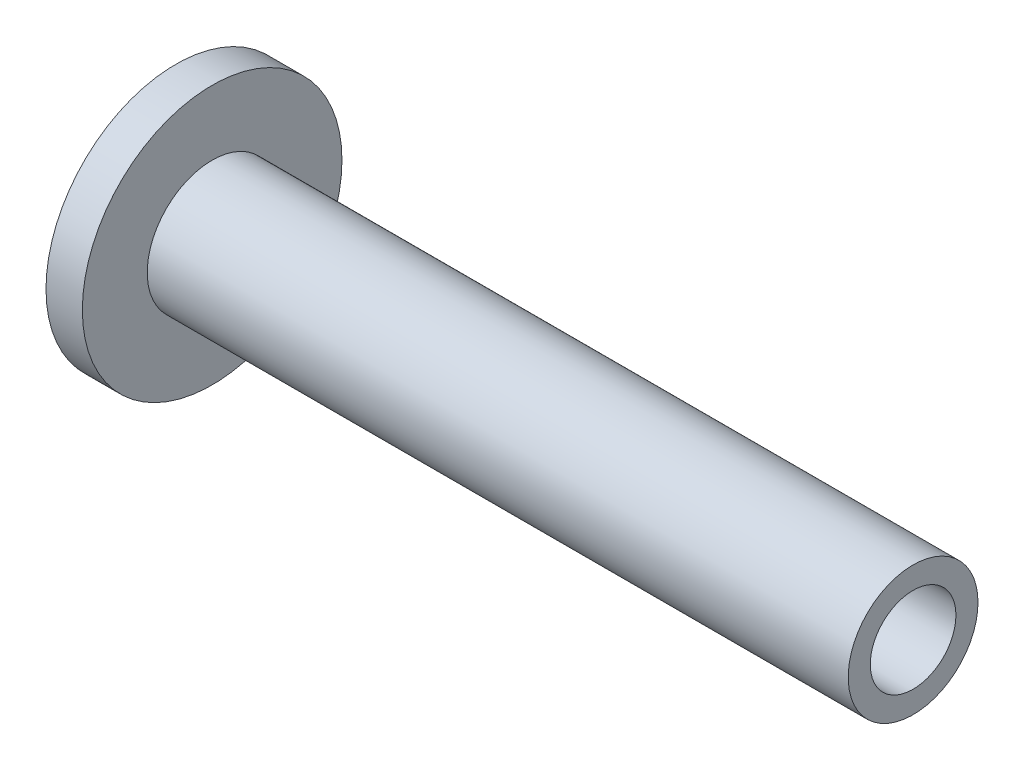
ISO-10303-21;
HEADER;
FILE_DESCRIPTION(('STEP AP214'),'2;1');
FILE_NAME('part.step','',(''),(''),'','','');
FILE_SCHEMA(('AUTOMOTIVE_DESIGN { 1 0 10303 214 1 1 1 1 }'));
ENDSEC;
DATA;
#1=APPLICATION_CONTEXT('core data for automotive mechanical design processes');
#2=APPLICATION_PROTOCOL_DEFINITION('international standard','automotive_design',2000,#1);
#3=PRODUCT_CONTEXT('',#1,'mechanical');
#4=PRODUCT('Part','Part','',(#3));
#5=PRODUCT_RELATED_PRODUCT_CATEGORY('part','',(#4));
#6=PRODUCT_DEFINITION_FORMATION('','',#4);
#7=PRODUCT_DEFINITION_CONTEXT('part definition',#1,'design');
#8=PRODUCT_DEFINITION('design','',#6,#7);
#9=PRODUCT_DEFINITION_SHAPE('','',#8);
#10=(LENGTH_UNIT() NAMED_UNIT(*) SI_UNIT(.MILLI.,.METRE.));
#11=(NAMED_UNIT(*) PLANE_ANGLE_UNIT() SI_UNIT($,.RADIAN.));
#12=(NAMED_UNIT(*) SI_UNIT($,.STERADIAN.) SOLID_ANGLE_UNIT());
#13=UNCERTAINTY_MEASURE_WITH_UNIT(LENGTH_MEASURE(1.E-05),#10,'distance_accuracy_value','');
#14=(GEOMETRIC_REPRESENTATION_CONTEXT(3) GLOBAL_UNCERTAINTY_ASSIGNED_CONTEXT((#13)) GLOBAL_UNIT_ASSIGNED_CONTEXT((#10,
#11,#12)) REPRESENTATION_CONTEXT('',''));
#15=CARTESIAN_POINT('',(0.,0.,0.));
#16=DIRECTION('',(0.,0.,1.));
#17=DIRECTION('',(1.,0.,0.));
#18=AXIS2_PLACEMENT_3D('',#15,#16,#17);
#19=CARTESIAN_POINT('',(1.9,0.,0.));
#20=DIRECTION('',(-1.,0.,0.));
#21=DIRECTION('',(0.,0.,1.));
#22=AXIS2_PLACEMENT_3D('',#19,#20,#21);
#23=CYLINDRICAL_SURFACE('',#22,5.);
#24=CARTESIAN_POINT('',(0.499999999999999,0.,0.));
#25=DIRECTION('',(1.,0.,0.));
#26=DIRECTION('',(0.,0.,-1.));
#27=AXIS2_PLACEMENT_3D('',#24,#25,#26);
#28=CIRCLE('',#27,5.);
#29=CARTESIAN_POINT('',(0.499999999999999,0.,5.));
#30=VERTEX_POINT('',#29);
#31=EDGE_CURVE('E45',#30,#30,#28,.T.);
#32=CARTESIAN_POINT('',(1.9,0.,0.));
#33=DIRECTION('',(1.,0.,0.));
#34=DIRECTION('',(0.,0.,-1.));
#35=AXIS2_PLACEMENT_3D('',#32,#33,#34);
#36=CIRCLE('',#35,5.);
#37=CARTESIAN_POINT('',(1.9,0.,5.));
#38=VERTEX_POINT('',#37);
#39=EDGE_CURVE('E68',#38,#38,#36,.T.);
#40=CARTESIAN_POINT('',(0.499999999999999,0.,5.));
#41=CARTESIAN_POINT('',(0.514583333333332,0.,5.));
#42=CARTESIAN_POINT('',(0.529166666666666,0.,5.));
#43=CARTESIAN_POINT('',(0.558333333333332,0.,5.));
#44=CARTESIAN_POINT('',(0.572916666666666,0.,5.));
#45=CARTESIAN_POINT('',(0.602083333333333,0.,5.));
#46=CARTESIAN_POINT('',(0.616666666666666,0.,5.));
#47=CARTESIAN_POINT('',(0.645833333333333,0.,5.));
#48=CARTESIAN_POINT('',(0.660416666666666,0.,5.));
#49=CARTESIAN_POINT('',(0.689583333333333,0.,5.));
#50=CARTESIAN_POINT('',(0.704166666666666,0.,5.));
#51=CARTESIAN_POINT('',(0.733333333333333,0.,5.));
#52=CARTESIAN_POINT('',(0.747916666666666,0.,5.));
#53=CARTESIAN_POINT('',(0.777083333333333,0.,5.));
#54=CARTESIAN_POINT('',(0.791666666666666,0.,5.));
#55=CARTESIAN_POINT('',(0.820833333333333,0.,5.));
#56=CARTESIAN_POINT('',(0.835416666666666,0.,5.));
#57=CARTESIAN_POINT('',(0.864583333333333,0.,5.));
#58=CARTESIAN_POINT('',(0.879166666666666,0.,5.));
#59=CARTESIAN_POINT('',(0.908333333333333,0.,5.));
#60=CARTESIAN_POINT('',(0.922916666666666,0.,5.));
#61=CARTESIAN_POINT('',(0.952083333333333,0.,5.));
#62=CARTESIAN_POINT('',(0.966666666666666,0.,5.));
#63=CARTESIAN_POINT('',(0.995833333333333,0.,5.));
#64=CARTESIAN_POINT('',(1.01041666666667,0.,5.));
#65=CARTESIAN_POINT('',(1.03958333333333,0.,5.));
#66=CARTESIAN_POINT('',(1.05416666666667,0.,5.));
#67=CARTESIAN_POINT('',(1.08333333333333,0.,5.));
#68=CARTESIAN_POINT('',(1.09791666666667,0.,5.));
#69=CARTESIAN_POINT('',(1.12708333333333,0.,5.));
#70=CARTESIAN_POINT('',(1.14166666666667,0.,5.));
#71=CARTESIAN_POINT('',(1.17083333333333,0.,5.));
#72=CARTESIAN_POINT('',(1.18541666666667,0.,5.));
#73=CARTESIAN_POINT('',(1.21458333333333,0.,5.));
#74=CARTESIAN_POINT('',(1.22916666666667,0.,5.));
#75=CARTESIAN_POINT('',(1.25833333333333,0.,5.));
#76=CARTESIAN_POINT('',(1.27291666666667,0.,5.));
#77=CARTESIAN_POINT('',(1.30208333333333,0.,5.));
#78=CARTESIAN_POINT('',(1.31666666666667,0.,5.));
#79=CARTESIAN_POINT('',(1.34583333333333,0.,5.));
#80=CARTESIAN_POINT('',(1.36041666666667,0.,5.));
#81=CARTESIAN_POINT('',(1.38958333333333,0.,5.));
#82=CARTESIAN_POINT('',(1.40416666666667,0.,5.));
#83=CARTESIAN_POINT('',(1.43333333333333,0.,5.));
#84=CARTESIAN_POINT('',(1.44791666666667,0.,5.));
#85=CARTESIAN_POINT('',(1.47708333333333,0.,5.));
#86=CARTESIAN_POINT('',(1.49166666666667,0.,5.));
#87=CARTESIAN_POINT('',(1.52083333333333,0.,5.));
#88=CARTESIAN_POINT('',(1.53541666666667,0.,5.));
#89=CARTESIAN_POINT('',(1.56458333333333,0.,5.));
#90=CARTESIAN_POINT('',(1.57916666666667,0.,5.));
#91=CARTESIAN_POINT('',(1.60833333333333,0.,5.));
#92=CARTESIAN_POINT('',(1.62291666666667,0.,5.));
#93=CARTESIAN_POINT('',(1.65208333333333,0.,5.));
#94=CARTESIAN_POINT('',(1.66666666666667,0.,5.));
#95=CARTESIAN_POINT('',(1.69583333333333,0.,5.));
#96=CARTESIAN_POINT('',(1.71041666666667,0.,5.));
#97=CARTESIAN_POINT('',(1.73958333333333,0.,5.));
#98=CARTESIAN_POINT('',(1.75416666666667,0.,5.));
#99=CARTESIAN_POINT('',(1.78333333333333,0.,5.));
#100=CARTESIAN_POINT('',(1.79791666666667,0.,5.));
#101=CARTESIAN_POINT('',(1.82708333333333,0.,5.));
#102=CARTESIAN_POINT('',(1.84166666666667,0.,5.));
#103=CARTESIAN_POINT('',(1.87083333333333,0.,5.));
#104=CARTESIAN_POINT('',(1.88541666666667,0.,5.));
#105=CARTESIAN_POINT('',(1.9,0.,5.));
#106=B_SPLINE_CURVE_WITH_KNOTS('',3,(#40,#41,#42,#43,#44,#45,#46,#47,#48,#49,#50,#51,#52,#53,
#54,#55,#56,#57,#58,#59,#60,#61,#62,#63,#64,#65,#66,#67,#68,#69,#70,#71,#72,#73,#74,#75,#76,#77,
#78,#79,#80,#81,#82,#83,#84,#85,#86,#87,#88,#89,#90,#91,#92,#93,#94,#95,#96,#97,#98,#99,#100,
#101,#102,#103,#104,#105),.UNSPECIFIED.,.F.,.F.,(4,2,2,2,2,2,2,2,2,2,2,2,2,2,2,2,2,2,2,2,2,2,2,
2,2,2,2,2,2,2,2,2,4),(0.,0.04375,0.0875000000000001,0.13125,0.175,0.21875,0.2625,0.30625,0.35,
0.39375,0.4375,0.48125,0.525,0.56875,0.6125,0.65625,0.7,0.74375,0.7875,0.83125,0.875,0.91875,
0.9625,1.00625,1.05,1.09375,1.1375,1.18125,1.225,1.26875,1.3125,1.35625,1.4),.UNSPECIFIED.);
#107=EDGE_CURVE('BSEAM38',#30,#38,#106,.T.);
#108=ORIENTED_EDGE('',*,*,#31,.T.);
#109=ORIENTED_EDGE('',*,*,#39,.F.);
#110=ORIENTED_EDGE('',*,*,#107,.T.);
#111=ORIENTED_EDGE('',*,*,#107,.F.);
#112=EDGE_LOOP('',(#108,#110,#109,#111));
#113=FACE_BOUND('',#112,.T.);
#114=ADVANCED_FACE('F38',(#113),#23,.T.);
#115=CARTESIAN_POINT('',(1.9,0.,0.));
#116=DIRECTION('',(1.,0.,0.));
#117=DIRECTION('',(0.,0.,-1.));
#118=AXIS2_PLACEMENT_3D('',#115,#116,#117);
#119=PLANE('',#118);
#120=CARTESIAN_POINT('',(1.9,0.,0.));
#121=DIRECTION('',(1.,0.,0.));
#122=DIRECTION('',(0.,0.,-1.));
#123=AXIS2_PLACEMENT_3D('',#120,#121,#122);
#124=CIRCLE('',#123,2.5);
#125=CARTESIAN_POINT('',(1.9,0.,-2.5));
#126=VERTEX_POINT('',#125);
#127=EDGE_CURVE('E58',#126,#126,#124,.T.);
#128=ORIENTED_EDGE('',*,*,#127,.F.);
#129=EDGE_LOOP('',(#128));
#130=FACE_BOUND('',#129,.T.);
#131=ORIENTED_EDGE('',*,*,#39,.T.);
#132=EDGE_LOOP('',(#131));
#133=FACE_BOUND('',#132,.T.);
#134=ADVANCED_FACE('F84',(#130,#133),#119,.T.);
#135=CARTESIAN_POINT('',(0.,0.,0.));
#136=DIRECTION('',(1.,0.,0.));
#137=DIRECTION('',(0.,0.,-1.));
#138=AXIS2_PLACEMENT_3D('',#135,#136,#137);
#139=PLANE('',#138);
#140=CARTESIAN_POINT('',(0.,0.,0.));
#141=DIRECTION('',(1.,0.,0.));
#142=DIRECTION('',(0.,0.,-1.));
#143=AXIS2_PLACEMENT_3D('',#140,#141,#142);
#144=CIRCLE('',#143,4.13397459621557);
#145=CARTESIAN_POINT('',(0.,0.,-4.13397459621557));
#146=VERTEX_POINT('',#145);
#147=EDGE_CURVE('E11',#146,#146,#144,.F.);
#148=ORIENTED_EDGE('',*,*,#147,.T.);
#149=EDGE_LOOP('',(#148));
#150=FACE_BOUND('',#149,.T.);
#151=ADVANCED_FACE('F88',(#150),#139,.F.);
#152=CARTESIAN_POINT('',(28.9,0.,0.));
#153=DIRECTION('',(-1.,0.,0.));
#154=DIRECTION('',(0.,0.,1.));
#155=AXIS2_PLACEMENT_3D('',#152,#153,#154);
#156=CYLINDRICAL_SURFACE('',#155,2.5);
#157=CARTESIAN_POINT('',(28.9,0.,0.));
#158=DIRECTION('',(1.,0.,0.));
#159=DIRECTION('',(0.,0.,-1.));
#160=AXIS2_PLACEMENT_3D('',#157,#158,#159);
#161=CIRCLE('',#160,2.5);
#162=CARTESIAN_POINT('',(28.9,0.,-2.5));
#163=VERTEX_POINT('',#162);
#164=EDGE_CURVE('E62',#163,#163,#161,.T.);
#165=ORIENTED_EDGE('',*,*,#164,.F.);
#166=EDGE_LOOP('',(#165));
#167=FACE_BOUND('',#166,.T.);
#168=ORIENTED_EDGE('',*,*,#127,.T.);
#169=EDGE_LOOP('',(#168));
#170=FACE_BOUND('',#169,.T.);
#171=ADVANCED_FACE('F93',(#167,#170),#156,.T.);
#172=CARTESIAN_POINT('',(28.9,0.,0.));
#173=DIRECTION('',(1.,0.,0.));
#174=DIRECTION('',(0.,0.,-1.));
#175=AXIS2_PLACEMENT_3D('',#172,#173,#174);
#176=PLANE('',#175);
#177=CARTESIAN_POINT('',(28.9,0.,0.));
#178=DIRECTION('',(1.,0.,0.));
#179=DIRECTION('',(0.,0.,-1.));
#180=AXIS2_PLACEMENT_3D('',#177,#178,#179);
#181=CIRCLE('',#180,1.65);
#182=CARTESIAN_POINT('',(28.9,0.,-1.65));
#183=VERTEX_POINT('',#182);
#184=EDGE_CURVE('E59',#183,#183,#181,.T.);
#185=ORIENTED_EDGE('',*,*,#184,.F.);
#186=EDGE_LOOP('',(#185));
#187=FACE_BOUND('',#186,.T.);
#188=ORIENTED_EDGE('',*,*,#164,.T.);
#189=EDGE_LOOP('',(#188));
#190=FACE_BOUND('',#189,.T.);
#191=ADVANCED_FACE('F52',(#187,#190),#176,.T.);
#192=CARTESIAN_POINT('',(18.8,0.,0.));
#193=DIRECTION('',(1.,0.,0.));
#194=DIRECTION('',(0.,0.,-1.));
#195=AXIS2_PLACEMENT_3D('',#192,#193,#194);
#196=CONICAL_SURFACE('',#195,1.65,1.02974425867665);
#197=CARTESIAN_POINT('',(17.8085799786045,0.,0.));
#198=VERTEX_POINT('',#197);
#199=VERTEX_LOOP('',#198);
#200=FACE_BOUND('',#199,.T.);
#201=CARTESIAN_POINT('',(18.8,0.,0.));
#202=DIRECTION('',(1.,0.,0.));
#203=DIRECTION('',(0.,0.,-1.));
#204=AXIS2_PLACEMENT_3D('',#201,#202,#203);
#205=CIRCLE('',#204,1.65);
#206=CARTESIAN_POINT('',(18.8,0.,-1.65));
#207=VERTEX_POINT('',#206);
#208=EDGE_CURVE('E56',#207,#207,#205,.T.);
#209=ORIENTED_EDGE('',*,*,#208,.T.);
#210=EDGE_LOOP('',(#209));
#211=FACE_BOUND('',#210,.T.);
#212=ADVANCED_FACE('F48',(#200,#211),#196,.F.);
#213=CARTESIAN_POINT('',(28.9,0.,0.));
#214=DIRECTION('',(1.,0.,0.));
#215=DIRECTION('',(0.,0.,-1.));
#216=AXIS2_PLACEMENT_3D('',#213,#214,#215);
#217=CYLINDRICAL_SURFACE('',#216,1.65);
#218=ORIENTED_EDGE('',*,*,#208,.F.);
#219=EDGE_LOOP('',(#218));
#220=FACE_BOUND('',#219,.T.);
#221=ORIENTED_EDGE('',*,*,#184,.T.);
#222=EDGE_LOOP('',(#221));
#223=FACE_BOUND('',#222,.T.);
#224=ADVANCED_FACE('F51',(#220,#223),#217,.F.);
#225=CARTESIAN_POINT('',(0.499999999999999,0.,0.));
#226=DIRECTION('',(1.,0.,0.));
#227=DIRECTION('',(0.,0.,-1.));
#228=AXIS2_PLACEMENT_3D('',#225,#226,#227);
#229=CONICAL_SURFACE('',#228,5.,1.04719755119659);
#230=ORIENTED_EDGE('',*,*,#147,.F.);
#231=EDGE_LOOP('',(#230));
#232=FACE_BOUND('',#231,.T.);
#233=ORIENTED_EDGE('',*,*,#31,.F.);
#234=EDGE_LOOP('',(#233));
#235=FACE_BOUND('',#234,.T.);
#236=ADVANCED_FACE('F40',(#232,#235),#229,.T.);
#237=CLOSED_SHELL('',(#114,#134,#151,#171,#191,#212,#224,#236));
#238=MANIFOLD_SOLID_BREP('B2',#237);
#239=ADVANCED_BREP_SHAPE_REPRESENTATION('',(#18,#238),#14);
#240=SHAPE_DEFINITION_REPRESENTATION(#9,#239);
ENDSEC;
END-ISO-10303-21;
